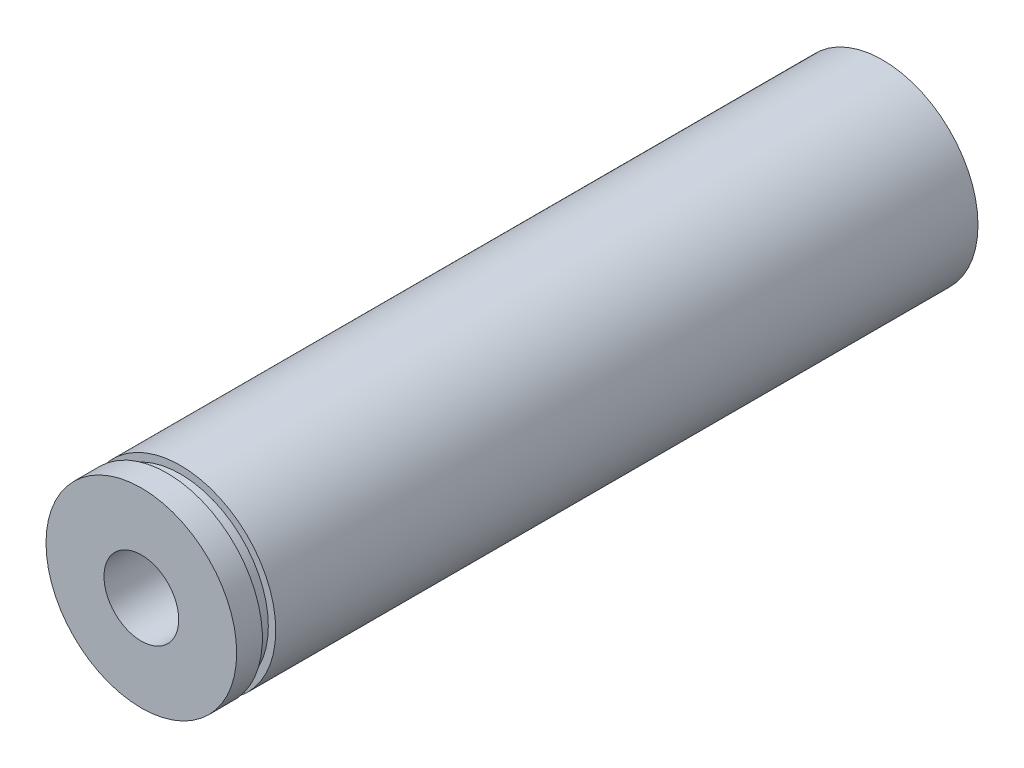
ISO-10303-21;
HEADER;
FILE_DESCRIPTION(('STEP AP214'),'2;1');
FILE_NAME('part.step','',(''),(''),'','','');
FILE_SCHEMA(('AUTOMOTIVE_DESIGN { 1 0 10303 214 1 1 1 1 }'));
ENDSEC;
DATA;
#1=APPLICATION_CONTEXT('core data for automotive mechanical design processes');
#2=APPLICATION_PROTOCOL_DEFINITION('international standard','automotive_design',2000,#1);
#3=PRODUCT_CONTEXT('',#1,'mechanical');
#4=PRODUCT('Part','Part','',(#3));
#5=PRODUCT_RELATED_PRODUCT_CATEGORY('part','',(#4));
#6=PRODUCT_DEFINITION_FORMATION('','',#4);
#7=PRODUCT_DEFINITION_CONTEXT('part definition',#1,'design');
#8=PRODUCT_DEFINITION('design','',#6,#7);
#9=PRODUCT_DEFINITION_SHAPE('','',#8);
#10=(LENGTH_UNIT() NAMED_UNIT(*) SI_UNIT(.MILLI.,.METRE.));
#11=(NAMED_UNIT(*) PLANE_ANGLE_UNIT() SI_UNIT($,.RADIAN.));
#12=(NAMED_UNIT(*) SI_UNIT($,.STERADIAN.) SOLID_ANGLE_UNIT());
#13=UNCERTAINTY_MEASURE_WITH_UNIT(LENGTH_MEASURE(1.E-05),#10,'distance_accuracy_value','');
#14=(GEOMETRIC_REPRESENTATION_CONTEXT(3) GLOBAL_UNCERTAINTY_ASSIGNED_CONTEXT((#13)) GLOBAL_UNIT_ASSIGNED_CONTEXT((#10,
#11,#12)) REPRESENTATION_CONTEXT('',''));
#15=CARTESIAN_POINT('',(0.,0.,0.));
#16=DIRECTION('',(0.,0.,1.));
#17=DIRECTION('',(1.,0.,0.));
#18=AXIS2_PLACEMENT_3D('',#15,#16,#17);
#19=CARTESIAN_POINT('',(0.,0.,24.6888));
#20=DIRECTION('',(0.,0.,-1.));
#21=DIRECTION('',(-1.,0.,0.));
#22=AXIS2_PLACEMENT_3D('',#19,#20,#21);
#23=CYLINDRICAL_SURFACE('',#22,6.35);
#24=CARTESIAN_POINT('',(0.,0.,24.6888));
#25=DIRECTION('',(0.,0.,1.));
#26=DIRECTION('',(1.,0.,0.));
#27=AXIS2_PLACEMENT_3D('',#24,#25,#26);
#28=CIRCLE('',#27,6.35);
#29=CARTESIAN_POINT('',(6.35,0.,24.6888));
#30=VERTEX_POINT('',#29);
#31=EDGE_CURVE('E10',#30,#30,#28,.T.);
#32=ORIENTED_EDGE('',*,*,#31,.F.);
#33=EDGE_LOOP('',(#32));
#34=FACE_BOUND('',#33,.T.);
#35=CARTESIAN_POINT('',(0.,0.,22.9743));
#36=DIRECTION('',(0.,0.,-1.));
#37=DIRECTION('',(-1.,0.,0.));
#38=AXIS2_PLACEMENT_3D('',#35,#36,#37);
#39=CIRCLE('',#38,6.35);
#40=CARTESIAN_POINT('',(-6.35,0.,22.9743));
#41=VERTEX_POINT('',#40);
#42=EDGE_CURVE('E46',#41,#41,#39,.T.);
#43=ORIENTED_EDGE('',*,*,#42,.F.);
#44=EDGE_LOOP('',(#43));
#45=FACE_BOUND('',#44,.T.);
#46=ADVANCED_FACE('F43',(#34,#45),#23,.T.);
#47=CARTESIAN_POINT('',(0.,0.,-24.6888));
#48=DIRECTION('',(0.,0.,1.));
#49=DIRECTION('',(1.,0.,0.));
#50=AXIS2_PLACEMENT_3D('',#47,#48,#49);
#51=CIRCLE('',#50,6.35);
#52=CARTESIAN_POINT('',(6.35,0.,-24.6888));
#53=VERTEX_POINT('',#52);
#54=EDGE_CURVE('E51',#53,#53,#51,.T.);
#55=ORIENTED_EDGE('',*,*,#54,.T.);
#56=EDGE_LOOP('',(#55));
#57=FACE_BOUND('',#56,.T.);
#58=CARTESIAN_POINT('',(0.,0.,22.0853));
#59=DIRECTION('',(0.,0.,1.));
#60=DIRECTION('',(1.,0.,0.));
#61=AXIS2_PLACEMENT_3D('',#58,#59,#60);
#62=CIRCLE('',#61,6.35);
#63=CARTESIAN_POINT('',(6.35,0.,22.0853));
#64=VERTEX_POINT('',#63);
#65=EDGE_CURVE('E62',#64,#64,#62,.T.);
#66=ORIENTED_EDGE('',*,*,#65,.F.);
#67=EDGE_LOOP('',(#66));
#68=FACE_BOUND('',#67,.T.);
#69=ADVANCED_FACE('F103',(#57,#68),#23,.T.);
#70=CARTESIAN_POINT('',(0.,0.,24.6888));
#71=DIRECTION('',(0.,0.,1.));
#72=DIRECTION('',(1.,0.,0.));
#73=AXIS2_PLACEMENT_3D('',#70,#71,#72);
#74=PLANE('',#73);
#75=ORIENTED_EDGE('',*,*,#31,.T.);
#76=EDGE_LOOP('',(#75));
#77=FACE_BOUND('',#76,.T.);
#78=CARTESIAN_POINT('',(0.,0.,24.6888));
#79=DIRECTION('',(0.,0.,1.));
#80=DIRECTION('',(1.,0.,0.));
#81=AXIS2_PLACEMENT_3D('',#78,#79,#80);
#82=CIRCLE('',#81,2.4892);
#83=CARTESIAN_POINT('',(2.4892,0.,24.6888));
#84=VERTEX_POINT('',#83);
#85=EDGE_CURVE('E57',#84,#84,#82,.T.);
#86=ORIENTED_EDGE('',*,*,#85,.F.);
#87=EDGE_LOOP('',(#86));
#88=FACE_BOUND('',#87,.T.);
#89=ADVANCED_FACE('F100',(#77,#88),#74,.T.);
#90=CARTESIAN_POINT('',(0.,0.,-24.6888));
#91=DIRECTION('',(0.,0.,1.));
#92=DIRECTION('',(1.,0.,0.));
#93=AXIS2_PLACEMENT_3D('',#90,#91,#92);
#94=PLANE('',#93);
#95=ORIENTED_EDGE('',*,*,#54,.F.);
#96=EDGE_LOOP('',(#95));
#97=FACE_BOUND('',#96,.T.);
#98=CARTESIAN_POINT('',(0.,0.,-24.6888));
#99=DIRECTION('',(0.,0.,1.));
#100=DIRECTION('',(1.,0.,0.));
#101=AXIS2_PLACEMENT_3D('',#98,#99,#100);
#102=CIRCLE('',#101,2.4892);
#103=CARTESIAN_POINT('',(2.4892,0.,-24.6888));
#104=VERTEX_POINT('',#103);
#105=EDGE_CURVE('E60',#104,#104,#102,.T.);
#106=ORIENTED_EDGE('',*,*,#105,.T.);
#107=EDGE_LOOP('',(#106));
#108=FACE_BOUND('',#107,.T.);
#109=ADVANCED_FACE('F87',(#97,#108),#94,.F.);
#110=CARTESIAN_POINT('',(0.,0.,24.6888));
#111=DIRECTION('',(0.,0.,-1.));
#112=DIRECTION('',(-1.,0.,0.));
#113=AXIS2_PLACEMENT_3D('',#110,#111,#112);
#114=CYLINDRICAL_SURFACE('',#113,2.4892);
#115=ORIENTED_EDGE('',*,*,#85,.T.);
#116=EDGE_LOOP('',(#115));
#117=FACE_BOUND('',#116,.T.);
#118=ORIENTED_EDGE('',*,*,#105,.F.);
#119=EDGE_LOOP('',(#118));
#120=FACE_BOUND('',#119,.T.);
#121=ADVANCED_FACE('F89',(#117,#120),#114,.F.);
#122=CARTESIAN_POINT('',(0.,6.858,22.9743));
#123=DIRECTION('',(0.,0.,-1.));
#124=DIRECTION('',(-1.,0.,0.));
#125=AXIS2_PLACEMENT_3D('',#122,#123,#124);
#126=PLANE('',#125);
#127=CARTESIAN_POINT('',(0.,0.,22.9743));
#128=DIRECTION('',(0.,0.,1.));
#129=DIRECTION('',(1.,0.,0.));
#130=AXIS2_PLACEMENT_3D('',#127,#128,#129);
#131=CIRCLE('',#130,5.8547);
#132=CARTESIAN_POINT('',(5.8547,0.,22.9743));
#133=VERTEX_POINT('',#132);
#134=EDGE_CURVE('E65',#133,#133,#131,.T.);
#135=ORIENTED_EDGE('',*,*,#134,.T.);
#136=EDGE_LOOP('',(#135));
#137=FACE_BOUND('',#136,.T.);
#138=ORIENTED_EDGE('',*,*,#42,.T.);
#139=EDGE_LOOP('',(#138));
#140=FACE_BOUND('',#139,.T.);
#141=ADVANCED_FACE('F91',(#137,#140),#126,.T.);
#142=CARTESIAN_POINT('',(0.,6.858,22.0853));
#143=DIRECTION('',(0.,0.,1.));
#144=DIRECTION('',(1.,0.,0.));
#145=AXIS2_PLACEMENT_3D('',#142,#143,#144);
#146=PLANE('',#145);
#147=CARTESIAN_POINT('',(0.,0.,22.0853));
#148=DIRECTION('',(0.,0.,1.));
#149=DIRECTION('',(1.,0.,0.));
#150=AXIS2_PLACEMENT_3D('',#147,#148,#149);
#151=CIRCLE('',#150,5.8547);
#152=CARTESIAN_POINT('',(5.8547,0.,22.0853));
#153=VERTEX_POINT('',#152);
#154=EDGE_CURVE('E72',#153,#153,#151,.T.);
#155=ORIENTED_EDGE('',*,*,#154,.F.);
#156=EDGE_LOOP('',(#155));
#157=FACE_BOUND('',#156,.T.);
#158=ORIENTED_EDGE('',*,*,#65,.T.);
#159=EDGE_LOOP('',(#158));
#160=FACE_BOUND('',#159,.T.);
#161=ADVANCED_FACE('F98',(#157,#160),#146,.T.);
#162=CARTESIAN_POINT('',(0.,0.,2.40563788453918));
#163=DIRECTION('',(0.,0.,1.));
#164=DIRECTION('',(1.,0.,0.));
#165=AXIS2_PLACEMENT_3D('',#162,#163,#164);
#166=CYLINDRICAL_SURFACE('',#165,5.8547);
#167=ORIENTED_EDGE('',*,*,#154,.T.);
#168=EDGE_LOOP('',(#167));
#169=FACE_BOUND('',#168,.T.);
#170=ORIENTED_EDGE('',*,*,#134,.F.);
#171=EDGE_LOOP('',(#170));
#172=FACE_BOUND('',#171,.T.);
#173=ADVANCED_FACE('F153',(#169,#172),#166,.T.);
#174=CLOSED_SHELL('',(#46,#69,#89,#109,#121,#141,#161,#173));
#175=MANIFOLD_SOLID_BREP('B2',#174);
#176=ADVANCED_BREP_SHAPE_REPRESENTATION('',(#18,#175),#14);
#177=SHAPE_DEFINITION_REPRESENTATION(#9,#176);
ENDSEC;
END-ISO-10303-21;
